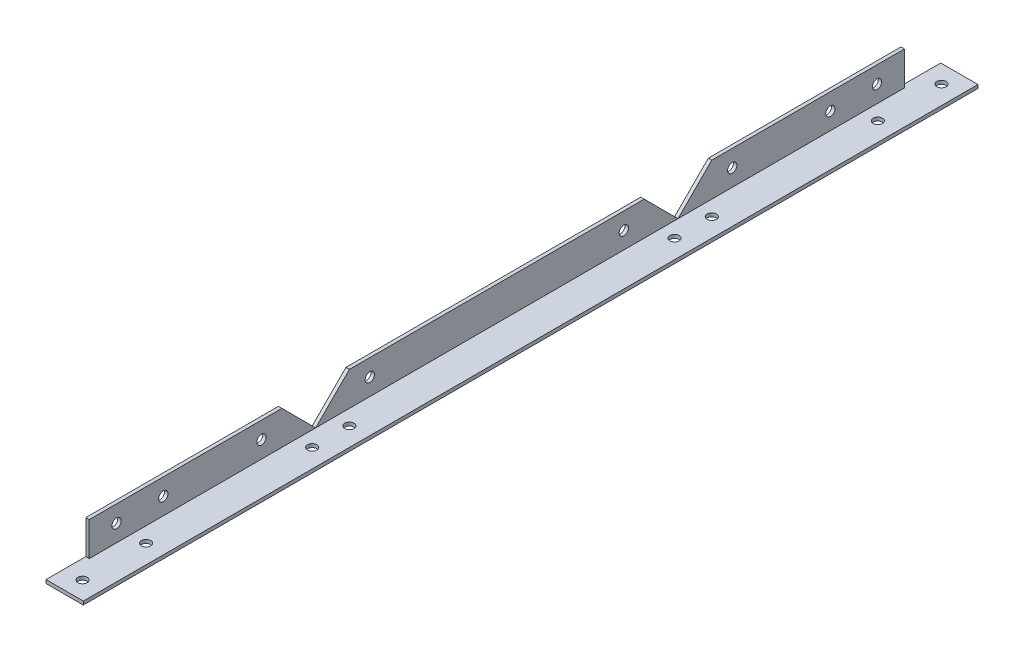
ISO-10303-21;
HEADER;
FILE_DESCRIPTION(('STEP AP214'),'2;1');
FILE_NAME('part.step','',(''),(''),'','','');
FILE_SCHEMA(('AUTOMOTIVE_DESIGN { 1 0 10303 214 1 1 1 1 }'));
ENDSEC;
DATA;
#1=APPLICATION_CONTEXT('core data for automotive mechanical design processes');
#2=APPLICATION_PROTOCOL_DEFINITION('international standard','automotive_design',2000,#1);
#3=PRODUCT_CONTEXT('',#1,'mechanical');
#4=PRODUCT('Part','Part','',(#3));
#5=PRODUCT_RELATED_PRODUCT_CATEGORY('part','',(#4));
#6=PRODUCT_DEFINITION_FORMATION('','',#4);
#7=PRODUCT_DEFINITION_CONTEXT('part definition',#1,'design');
#8=PRODUCT_DEFINITION('design','',#6,#7);
#9=PRODUCT_DEFINITION_SHAPE('','',#8);
#10=(LENGTH_UNIT() NAMED_UNIT(*) SI_UNIT(.MILLI.,.METRE.));
#11=(NAMED_UNIT(*) PLANE_ANGLE_UNIT() SI_UNIT($,.RADIAN.));
#12=(NAMED_UNIT(*) SI_UNIT($,.STERADIAN.) SOLID_ANGLE_UNIT());
#13=UNCERTAINTY_MEASURE_WITH_UNIT(LENGTH_MEASURE(1.E-05),#10,'distance_accuracy_value','');
#14=(GEOMETRIC_REPRESENTATION_CONTEXT(3) GLOBAL_UNCERTAINTY_ASSIGNED_CONTEXT((#13)) GLOBAL_UNIT_ASSIGNED_CONTEXT((#10,
#11,#12)) REPRESENTATION_CONTEXT('',''));
#15=CARTESIAN_POINT('',(0.,0.,0.));
#16=DIRECTION('',(0.,0.,1.));
#17=DIRECTION('',(1.,0.,0.));
#18=AXIS2_PLACEMENT_3D('',#15,#16,#17);
#19=CARTESIAN_POINT('',(0.,1.2490009027033E-13,208.28));
#20=DIRECTION('',(-1.,0.,0.));
#21=DIRECTION('',(0.,-1.,0.));
#22=AXIS2_PLACEMENT_3D('',#19,#20,#21);
#23=PLANE('',#22);
#24=CARTESIAN_POINT('',(0.,8.63599999999988,-194.31));
#25=DIRECTION('',(-1.,0.,0.));
#26=DIRECTION('',(0.,1.,0.));
#27=AXIS2_PLACEMENT_3D('',#24,#25,#26);
#28=CIRCLE('',#27,2.38125000000001);
#29=CARTESIAN_POINT('',(0.,11.0172499999999,-194.31));
#30=VERTEX_POINT('',#29);
#31=EDGE_CURVE('E164',#30,#30,#28,.T.);
#32=ORIENTED_EDGE('',*,*,#31,.T.);
#33=EDGE_LOOP('',(#32));
#34=FACE_BOUND('',#33,.T.);
#35=CARTESIAN_POINT('',(0.,8.63599999999988,-170.434));
#36=DIRECTION('',(-1.,0.,0.));
#37=DIRECTION('',(0.,1.,0.));
#38=AXIS2_PLACEMENT_3D('',#35,#36,#37);
#39=CIRCLE('',#38,2.38125000000001);
#40=CARTESIAN_POINT('',(0.,11.0172499999999,-170.434));
#41=VERTEX_POINT('',#40);
#42=EDGE_CURVE('E172',#41,#41,#39,.T.);
#43=ORIENTED_EDGE('',*,*,#42,.T.);
#44=EDGE_LOOP('',(#43));
#45=FACE_BOUND('',#44,.T.);
#46=CARTESIAN_POINT('',(0.,8.63599999999992,-120.269));
#47=DIRECTION('',(-1.,0.,0.));
#48=DIRECTION('',(0.,1.,0.));
#49=AXIS2_PLACEMENT_3D('',#46,#47,#48);
#50=CIRCLE('',#49,2.38125000000001);
#51=CARTESIAN_POINT('',(0.,11.0172499999999,-120.269));
#52=VERTEX_POINT('',#51);
#53=EDGE_CURVE('E178',#52,#52,#50,.T.);
#54=ORIENTED_EDGE('',*,*,#53,.T.);
#55=EDGE_LOOP('',(#54));
#56=FACE_BOUND('',#55,.T.);
#57=DIRECTION('',(0.,-0.707106781186543,0.707106781186551));
#58=VECTOR('',#57,1.);
#59=CARTESIAN_POINT('',(0.,0.,-92.583));
#60=LINE('',#59,#58);
#61=CARTESIAN_POINT('',(0.,17.2719999999999,-109.855));
#62=VERTEX_POINT('',#61);
#63=CARTESIAN_POINT('',(0.,0.,-92.583));
#64=VERTEX_POINT('',#63);
#65=EDGE_CURVE('E194',#62,#64,#60,.T.);
#66=ORIENTED_EDGE('',*,*,#65,.T.);
#67=DIRECTION('',(0.,0.,-1.));
#68=VECTOR('',#67,1.);
#69=CARTESIAN_POINT('',(0.,1.2490009027033E-13,208.28));
#70=LINE('',#69,#68);
#71=CARTESIAN_POINT('',(0.,-1.2490009027033E-13,-208.28));
#72=VERTEX_POINT('',#71);
#73=EDGE_CURVE('E310',#64,#72,#70,.T.);
#74=ORIENTED_EDGE('',*,*,#73,.T.);
#75=DIRECTION('',(0.,1.,0.));
#76=VECTOR('',#75,1.);
#77=CARTESIAN_POINT('',(0.,-1.2490009027033E-13,-208.28));
#78=LINE('',#77,#76);
#79=CARTESIAN_POINT('',(0.,17.2719999999999,-208.28));
#80=VERTEX_POINT('',#79);
#81=EDGE_CURVE('E208',#72,#80,#78,.T.);
#82=ORIENTED_EDGE('',*,*,#81,.T.);
#83=DIRECTION('',(0.,0.,-1.));
#84=VECTOR('',#83,1.);
#85=CARTESIAN_POINT('',(0.,17.2720000000001,208.28));
#86=LINE('',#85,#84);
#87=EDGE_CURVE('E306',#62,#80,#86,.T.);
#88=ORIENTED_EDGE('',*,*,#87,.F.);
#89=EDGE_LOOP('',(#66,#74,#82,#88));
#90=FACE_BOUND('',#89,.T.);
#91=ADVANCED_FACE('F35',(#34,#45,#56,#90),#23,.F.);
#92=CARTESIAN_POINT('',(0.,8.63599999999996,-64.8969999999998));
#93=DIRECTION('',(-1.,0.,0.));
#94=DIRECTION('',(0.,1.,0.));
#95=AXIS2_PLACEMENT_3D('',#92,#93,#94);
#96=CIRCLE('',#95,2.38125000000001);
#97=CARTESIAN_POINT('',(0.,11.01725,-64.8969999999998));
#98=VERTEX_POINT('',#97);
#99=EDGE_CURVE('E144',#98,#98,#96,.T.);
#100=ORIENTED_EDGE('',*,*,#99,.T.);
#101=EDGE_LOOP('',(#100));
#102=FACE_BOUND('',#101,.T.);
#103=CARTESIAN_POINT('',(0.,8.63600000000005,64.8969999999998));
#104=DIRECTION('',(1.,0.,0.));
#105=DIRECTION('',(0.,1.,0.));
#106=AXIS2_PLACEMENT_3D('',#103,#104,#105);
#107=CIRCLE('',#106,2.38125000000001);
#108=CARTESIAN_POINT('',(0.,11.0172500000001,64.8969999999998));
#109=VERTEX_POINT('',#108);
#110=EDGE_CURVE('E251',#109,#109,#107,.T.);
#111=ORIENTED_EDGE('',*,*,#110,.F.);
#112=EDGE_LOOP('',(#111));
#113=FACE_BOUND('',#112,.T.);
#114=DIRECTION('',(0.,0.707106781186544,0.707106781186551));
#115=VECTOR('',#114,1.);
#116=CARTESIAN_POINT('',(0.,17.272,-75.3109999999998));
#117=LINE('',#116,#115);
#118=CARTESIAN_POINT('',(0.,17.272,-75.3109999999998));
#119=VERTEX_POINT('',#118);
#120=EDGE_CURVE('E171',#64,#119,#117,.T.);
#121=ORIENTED_EDGE('',*,*,#120,.T.);
#122=CARTESIAN_POINT('',(0.,17.2720000000001,75.3109999999998));
#123=VERTEX_POINT('',#122);
#124=EDGE_CURVE('E311',#123,#119,#86,.T.);
#125=ORIENTED_EDGE('',*,*,#124,.F.);
#126=DIRECTION('',(0.,0.707106781186544,-0.707106781186551));
#127=VECTOR('',#126,1.);
#128=CARTESIAN_POINT('',(0.,17.2720000000001,75.3109999999998));
#129=LINE('',#128,#127);
#130=CARTESIAN_POINT('',(0.,0.,92.583));
#131=VERTEX_POINT('',#130);
#132=EDGE_CURVE('E259',#131,#123,#129,.T.);
#133=ORIENTED_EDGE('',*,*,#132,.F.);
#134=EDGE_CURVE('E317',#131,#64,#70,.T.);
#135=ORIENTED_EDGE('',*,*,#134,.T.);
#136=EDGE_LOOP('',(#121,#125,#133,#135));
#137=FACE_BOUND('',#136,.T.);
#138=ADVANCED_FACE('F335',(#102,#113,#137),#23,.F.);
#139=CARTESIAN_POINT('',(0.,17.2720000000001,208.28));
#140=DIRECTION('',(0.,-1.,0.));
#141=DIRECTION('',(0.,0.,-1.));
#142=AXIS2_PLACEMENT_3D('',#139,#140,#141);
#143=PLANE('',#142);
#144=DIRECTION('',(1.,0.,0.));
#145=VECTOR('',#144,1.);
#146=CARTESIAN_POINT('',(-40.3993661073767,17.2719999999999,-109.855));
#147=LINE('',#146,#145);
#148=CARTESIAN_POINT('',(-1.778,17.2719999999999,-109.855));
#149=VERTEX_POINT('',#148);
#150=EDGE_CURVE('E199',#149,#62,#147,.T.);
#151=ORIENTED_EDGE('',*,*,#150,.T.);
#152=ORIENTED_EDGE('',*,*,#87,.T.);
#153=DIRECTION('',(-1.,0.,0.));
#154=VECTOR('',#153,1.);
#155=CARTESIAN_POINT('',(0.,17.2719999999999,-208.28));
#156=LINE('',#155,#154);
#157=CARTESIAN_POINT('',(-1.778,17.2719999999999,-208.28));
#158=VERTEX_POINT('',#157);
#159=EDGE_CURVE('E205',#80,#158,#156,.T.);
#160=ORIENTED_EDGE('',*,*,#159,.T.);
#161=DIRECTION('',(0.,0.,-1.));
#162=VECTOR('',#161,1.);
#163=CARTESIAN_POINT('',(-1.77800000000004,17.2720000000001,208.28));
#164=LINE('',#163,#162);
#165=EDGE_CURVE('E303',#149,#158,#164,.T.);
#166=ORIENTED_EDGE('',*,*,#165,.F.);
#167=EDGE_LOOP('',(#151,#152,#160,#166));
#168=FACE_BOUND('',#167,.T.);
#169=ADVANCED_FACE('F322',(#168),#143,.F.);
#170=DIRECTION('',(1.,0.,0.));
#171=VECTOR('',#170,1.);
#172=CARTESIAN_POINT('',(-40.3993661073767,17.272,-75.3109999999998));
#173=LINE('',#172,#171);
#174=CARTESIAN_POINT('',(-1.778,17.272,-75.3109999999998));
#175=VERTEX_POINT('',#174);
#176=EDGE_CURVE('E197',#175,#119,#173,.T.);
#177=ORIENTED_EDGE('',*,*,#176,.F.);
#178=CARTESIAN_POINT('',(-1.778,17.2720000000001,75.3109999999998));
#179=VERTEX_POINT('',#178);
#180=EDGE_CURVE('E307',#179,#175,#164,.T.);
#181=ORIENTED_EDGE('',*,*,#180,.F.);
#182=DIRECTION('',(1.,0.,0.));
#183=VECTOR('',#182,1.);
#184=CARTESIAN_POINT('',(-40.3993661073767,17.2720000000001,75.3109999999998));
#185=LINE('',#184,#183);
#186=EDGE_CURVE('E287',#179,#123,#185,.T.);
#187=ORIENTED_EDGE('',*,*,#186,.T.);
#188=ORIENTED_EDGE('',*,*,#124,.T.);
#189=EDGE_LOOP('',(#177,#181,#187,#188));
#190=FACE_BOUND('',#189,.T.);
#191=ADVANCED_FACE('F364',(#190),#143,.F.);
#192=CARTESIAN_POINT('',(-1.77800000000004,17.2720000000001,208.28));
#193=DIRECTION('',(1.,0.,0.));
#194=DIRECTION('',(0.,1.,0.));
#195=AXIS2_PLACEMENT_3D('',#192,#193,#194);
#196=PLANE('',#195);
#197=CARTESIAN_POINT('',(-1.778,8.63599999999988,-194.31));
#198=DIRECTION('',(1.,0.,0.));
#199=DIRECTION('',(0.,1.,0.));
#200=AXIS2_PLACEMENT_3D('',#197,#198,#199);
#201=CIRCLE('',#200,2.38125000000001);
#202=CARTESIAN_POINT('',(-1.778,11.0172499999999,-194.31));
#203=VERTEX_POINT('',#202);
#204=EDGE_CURVE('E167',#203,#203,#201,.T.);
#205=ORIENTED_EDGE('',*,*,#204,.T.);
#206=EDGE_LOOP('',(#205));
#207=FACE_BOUND('',#206,.T.);
#208=CARTESIAN_POINT('',(-1.778,8.63599999999988,-170.434));
#209=DIRECTION('',(1.,0.,0.));
#210=DIRECTION('',(0.,1.,0.));
#211=AXIS2_PLACEMENT_3D('',#208,#209,#210);
#212=CIRCLE('',#211,2.38125000000001);
#213=CARTESIAN_POINT('',(-1.778,11.0172499999999,-170.434));
#214=VERTEX_POINT('',#213);
#215=EDGE_CURVE('E168',#214,#214,#212,.T.);
#216=ORIENTED_EDGE('',*,*,#215,.T.);
#217=EDGE_LOOP('',(#216));
#218=FACE_BOUND('',#217,.T.);
#219=CARTESIAN_POINT('',(-1.778,8.63599999999992,-120.269));
#220=DIRECTION('',(1.,0.,0.));
#221=DIRECTION('',(0.,1.,0.));
#222=AXIS2_PLACEMENT_3D('',#219,#220,#221);
#223=CIRCLE('',#222,2.38125000000001);
#224=CARTESIAN_POINT('',(-1.778,11.0172499999999,-120.269));
#225=VERTEX_POINT('',#224);
#226=EDGE_CURVE('E175',#225,#225,#223,.T.);
#227=ORIENTED_EDGE('',*,*,#226,.T.);
#228=EDGE_LOOP('',(#227));
#229=FACE_BOUND('',#228,.T.);
#230=CARTESIAN_POINT('',(-1.778,8.63599999999996,-64.8969999999998));
#231=DIRECTION('',(1.,0.,0.));
#232=DIRECTION('',(0.,1.,0.));
#233=AXIS2_PLACEMENT_3D('',#230,#231,#232);
#234=CIRCLE('',#233,2.38125000000001);
#235=CARTESIAN_POINT('',(-1.778,11.01725,-64.8969999999998));
#236=VERTEX_POINT('',#235);
#237=EDGE_CURVE('E181',#236,#236,#234,.T.);
#238=ORIENTED_EDGE('',*,*,#237,.T.);
#239=EDGE_LOOP('',(#238));
#240=FACE_BOUND('',#239,.T.);
#241=CARTESIAN_POINT('',(-1.778,8.63600000000005,64.8969999999998));
#242=DIRECTION('',(1.,0.,0.));
#243=DIRECTION('',(0.,1.,0.));
#244=AXIS2_PLACEMENT_3D('',#241,#242,#243);
#245=CIRCLE('',#244,2.38125000000001);
#246=CARTESIAN_POINT('',(-1.778,11.0172500000001,64.8969999999998));
#247=VERTEX_POINT('',#246);
#248=EDGE_CURVE('E269',#247,#247,#245,.F.);
#249=ORIENTED_EDGE('',*,*,#248,.F.);
#250=EDGE_LOOP('',(#249));
#251=FACE_BOUND('',#250,.T.);
#252=CARTESIAN_POINT('',(-1.77800000000004,8.63600000000009,120.269));
#253=DIRECTION('',(1.,0.,0.));
#254=DIRECTION('',(0.,1.,0.));
#255=AXIS2_PLACEMENT_3D('',#252,#253,#254);
#256=CIRCLE('',#255,2.38125000000001);
#257=CARTESIAN_POINT('',(-1.77800000000004,11.0172500000001,120.269));
#258=VERTEX_POINT('',#257);
#259=EDGE_CURVE('E263',#258,#258,#256,.F.);
#260=ORIENTED_EDGE('',*,*,#259,.F.);
#261=EDGE_LOOP('',(#260));
#262=FACE_BOUND('',#261,.T.);
#263=CARTESIAN_POINT('',(-1.77800000000004,8.63600000000013,170.434));
#264=DIRECTION('',(1.,0.,0.));
#265=DIRECTION('',(0.,1.,0.));
#266=AXIS2_PLACEMENT_3D('',#263,#264,#265);
#267=CIRCLE('',#266,2.38125000000001);
#268=CARTESIAN_POINT('',(-1.77800000000004,11.0172500000001,170.434));
#269=VERTEX_POINT('',#268);
#270=EDGE_CURVE('E256',#269,#269,#267,.F.);
#271=ORIENTED_EDGE('',*,*,#270,.F.);
#272=EDGE_LOOP('',(#271));
#273=FACE_BOUND('',#272,.T.);
#274=CARTESIAN_POINT('',(-1.77800000000004,8.63600000000013,194.31));
#275=DIRECTION('',(1.,0.,0.));
#276=DIRECTION('',(0.,1.,0.));
#277=AXIS2_PLACEMENT_3D('',#274,#275,#276);
#278=CIRCLE('',#277,2.38125000000001);
#279=CARTESIAN_POINT('',(-1.77800000000004,11.0172500000001,194.31));
#280=VERTEX_POINT('',#279);
#281=EDGE_CURVE('E255',#280,#280,#278,.F.);
#282=ORIENTED_EDGE('',*,*,#281,.F.);
#283=EDGE_LOOP('',(#282));
#284=FACE_BOUND('',#283,.T.);
#285=DIRECTION('',(0.,0.707106781186543,-0.707106781186551));
#286=VECTOR('',#285,1.);
#287=CARTESIAN_POINT('',(-1.778,0.,-92.583));
#288=LINE('',#287,#286);
#289=CARTESIAN_POINT('',(-1.778,0.,-92.583));
#290=VERTEX_POINT('',#289);
#291=EDGE_CURVE('E191',#290,#149,#288,.T.);
#292=ORIENTED_EDGE('',*,*,#291,.T.);
#293=ORIENTED_EDGE('',*,*,#165,.T.);
#294=DIRECTION('',(0.,-1.,0.));
#295=VECTOR('',#294,1.);
#296=CARTESIAN_POINT('',(-1.778,17.2719999999999,-208.28));
#297=LINE('',#296,#295);
#298=CARTESIAN_POINT('',(-1.778,-1.2490009027033E-13,-208.28));
#299=VERTEX_POINT('',#298);
#300=EDGE_CURVE('E143',#158,#299,#297,.T.);
#301=ORIENTED_EDGE('',*,*,#300,.T.);
#302=DIRECTION('',(0.,0.,1.));
#303=VECTOR('',#302,1.);
#304=CARTESIAN_POINT('',(-1.778,-1.66533453693773E-13,-228.6));
#305=LINE('',#304,#303);
#306=CARTESIAN_POINT('',(-1.778,-1.66533453693773E-13,-228.6));
#307=VERTEX_POINT('',#306);
#308=EDGE_CURVE('E52',#307,#299,#305,.T.);
#309=ORIENTED_EDGE('',*,*,#308,.F.);
#310=DIRECTION('',(0.,-1.,0.));
#311=VECTOR('',#310,1.);
#312=CARTESIAN_POINT('',(-1.778,-1.77800000000017,-228.6));
#313=LINE('',#312,#311);
#314=CARTESIAN_POINT('',(-1.778,-1.77800000000017,-228.6));
#315=VERTEX_POINT('',#314);
#316=EDGE_CURVE('E140',#307,#315,#313,.T.);
#317=ORIENTED_EDGE('',*,*,#316,.T.);
#318=DIRECTION('',(0.,0.,-1.));
#319=VECTOR('',#318,1.);
#320=CARTESIAN_POINT('',(-1.77800000000004,-1.77799999999988,208.28));
#321=LINE('',#320,#319);
#322=CARTESIAN_POINT('',(-1.77800000000003,-1.77799999999984,228.6));
#323=VERTEX_POINT('',#322);
#324=EDGE_CURVE('E301',#323,#315,#321,.T.);
#325=ORIENTED_EDGE('',*,*,#324,.F.);
#326=DIRECTION('',(0.,-1.,0.));
#327=VECTOR('',#326,1.);
#328=CARTESIAN_POINT('',(-1.77800000000003,-1.77799999999984,228.6));
#329=LINE('',#328,#327);
#330=CARTESIAN_POINT('',(-1.77800000000003,1.66533453693773E-13,228.6));
#331=VERTEX_POINT('',#330);
#332=EDGE_CURVE('E235',#331,#323,#329,.T.);
#333=ORIENTED_EDGE('',*,*,#332,.F.);
#334=DIRECTION('',(0.,0.,-1.));
#335=VECTOR('',#334,1.);
#336=CARTESIAN_POINT('',(-1.77800000000003,1.66533453693773E-13,228.6));
#337=LINE('',#336,#335);
#338=CARTESIAN_POINT('',(-1.77800000000004,1.2490009027033E-13,208.28));
#339=VERTEX_POINT('',#338);
#340=EDGE_CURVE('E246',#331,#339,#337,.T.);
#341=ORIENTED_EDGE('',*,*,#340,.T.);
#342=DIRECTION('',(0.,-1.,0.));
#343=VECTOR('',#342,1.);
#344=CARTESIAN_POINT('',(-1.77800000000004,17.2720000000001,208.28));
#345=LINE('',#344,#343);
#346=CARTESIAN_POINT('',(-1.77800000000004,17.2720000000001,208.28));
#347=VERTEX_POINT('',#346);
#348=EDGE_CURVE('E296',#347,#339,#345,.T.);
#349=ORIENTED_EDGE('',*,*,#348,.F.);
#350=CARTESIAN_POINT('',(-1.778,17.2720000000001,109.855));
#351=VERTEX_POINT('',#350);
#352=EDGE_CURVE('E304',#347,#351,#164,.T.);
#353=ORIENTED_EDGE('',*,*,#352,.T.);
#354=DIRECTION('',(0.,0.707106781186544,0.707106781186552));
#355=VECTOR('',#354,1.);
#356=CARTESIAN_POINT('',(-1.778,0.,92.583));
#357=LINE('',#356,#355);
#358=CARTESIAN_POINT('',(-1.778,0.,92.583));
#359=VERTEX_POINT('',#358);
#360=EDGE_CURVE('E276',#359,#351,#357,.T.);
#361=ORIENTED_EDGE('',*,*,#360,.F.);
#362=DIRECTION('',(0.,-0.707106781186544,0.707106781186551));
#363=VECTOR('',#362,1.);
#364=CARTESIAN_POINT('',(-1.778,17.2720000000001,75.3109999999998));
#365=LINE('',#364,#363);
#366=EDGE_CURVE('E278',#179,#359,#365,.T.);
#367=ORIENTED_EDGE('',*,*,#366,.F.);
#368=ORIENTED_EDGE('',*,*,#180,.T.);
#369=DIRECTION('',(0.,-0.707106781186544,-0.707106781186551));
#370=VECTOR('',#369,1.);
#371=CARTESIAN_POINT('',(-1.778,17.272,-75.3109999999998));
#372=LINE('',#371,#370);
#373=EDGE_CURVE('E188',#175,#290,#372,.T.);
#374=ORIENTED_EDGE('',*,*,#373,.T.);
#375=EDGE_LOOP('',(#292,#293,#301,#309,#317,#325,#333,#341,#349,#353,#361,#367,#368,#374));
#376=FACE_BOUND('',#375,.T.);
#377=ADVANCED_FACE('F139',(#207,#218,#229,#240,#251,#262,#273,#284,#376),#196,.F.);
#378=CARTESIAN_POINT('',(0.,1.2490009027033E-13,208.28));
#379=DIRECTION('',(0.,0.,-1.));
#380=DIRECTION('',(-1.,0.,0.));
#381=AXIS2_PLACEMENT_3D('',#378,#379,#380);
#382=PLANE('',#381);
#383=DIRECTION('',(-1.,0.,0.));
#384=VECTOR('',#383,1.);
#385=CARTESIAN_POINT('',(-1.77800000000004,1.2490009027033E-13,208.28));
#386=LINE('',#385,#384);
#387=CARTESIAN_POINT('',(0.,1.2490009027033E-13,208.28));
#388=VERTEX_POINT('',#387);
#389=EDGE_CURVE('E44',#388,#339,#386,.T.);
#390=ORIENTED_EDGE('',*,*,#389,.F.);
#391=DIRECTION('',(0.,1.,0.));
#392=VECTOR('',#391,1.);
#393=CARTESIAN_POINT('',(0.,1.2490009027033E-13,208.28));
#394=LINE('',#393,#392);
#395=CARTESIAN_POINT('',(0.,17.2720000000001,208.28));
#396=VERTEX_POINT('',#395);
#397=EDGE_CURVE('E282',#388,#396,#394,.T.);
#398=ORIENTED_EDGE('',*,*,#397,.T.);
#399=DIRECTION('',(-1.,0.,0.));
#400=VECTOR('',#399,1.);
#401=CARTESIAN_POINT('',(0.,17.2720000000001,208.28));
#402=LINE('',#401,#400);
#403=EDGE_CURVE('E294',#396,#347,#402,.T.);
#404=ORIENTED_EDGE('',*,*,#403,.T.);
#405=ORIENTED_EDGE('',*,*,#348,.T.);
#406=EDGE_LOOP('',(#390,#398,#404,#405));
#407=FACE_BOUND('',#406,.T.);
#408=ADVANCED_FACE('F380',(#407),#382,.F.);
#409=CARTESIAN_POINT('',(17.272,1.2490009027033E-13,208.28));
#410=DIRECTION('',(0.,-1.,0.));
#411=DIRECTION('',(1.,0.,0.));
#412=AXIS2_PLACEMENT_3D('',#409,#410,#411);
#413=PLANE('',#412);
#414=CARTESIAN_POINT('',(7.747,0.,-83.058));
#415=DIRECTION('',(0.,-1.,0.));
#416=DIRECTION('',(-1.,0.,0.));
#417=AXIS2_PLACEMENT_3D('',#414,#415,#416);
#418=CIRCLE('',#417,2.38125);
#419=CARTESIAN_POINT('',(5.36575,0.,-83.058));
#420=VERTEX_POINT('',#419);
#421=EDGE_CURVE('E509',#420,#420,#418,.T.);
#422=ORIENTED_EDGE('',*,*,#421,.T.);
#423=EDGE_LOOP('',(#422));
#424=FACE_BOUND('',#423,.T.);
#425=CARTESIAN_POINT('',(7.747,0.,-102.108));
#426=DIRECTION('',(0.,-1.,0.));
#427=DIRECTION('',(-1.,0.,0.));
#428=AXIS2_PLACEMENT_3D('',#425,#426,#427);
#429=CIRCLE('',#428,2.38125);
#430=CARTESIAN_POINT('',(5.36575,0.,-102.108));
#431=VERTEX_POINT('',#430);
#432=EDGE_CURVE('E515',#431,#431,#429,.T.);
#433=ORIENTED_EDGE('',*,*,#432,.T.);
#434=EDGE_LOOP('',(#433));
#435=FACE_BOUND('',#434,.T.);
#436=CARTESIAN_POINT('',(7.74699999999999,-1.2490009027033E-13,-186.944));
#437=DIRECTION('',(0.,-1.,0.));
#438=DIRECTION('',(-1.,0.,0.));
#439=AXIS2_PLACEMENT_3D('',#436,#437,#438);
#440=CIRCLE('',#439,2.38125);
#441=CARTESIAN_POINT('',(5.36574999999999,-1.2496453235552E-13,-186.944));
#442=VERTEX_POINT('',#441);
#443=EDGE_CURVE('E521',#442,#442,#440,.T.);
#444=ORIENTED_EDGE('',*,*,#443,.T.);
#445=EDGE_LOOP('',(#444));
#446=FACE_BOUND('',#445,.T.);
#447=CARTESIAN_POINT('',(7.74699999999999,-1.66533453693773E-13,-219.456));
#448=DIRECTION('',(0.,-1.,0.));
#449=DIRECTION('',(-1.,0.,0.));
#450=AXIS2_PLACEMENT_3D('',#447,#448,#449);
#451=CIRCLE('',#450,2.38125);
#452=CARTESIAN_POINT('',(5.36574999999999,-1.66597895778963E-13,-219.456));
#453=VERTEX_POINT('',#452);
#454=EDGE_CURVE('E512',#453,#453,#451,.T.);
#455=ORIENTED_EDGE('',*,*,#454,.T.);
#456=EDGE_LOOP('',(#455));
#457=FACE_BOUND('',#456,.T.);
#458=CARTESIAN_POINT('',(7.747,0.,83.058));
#459=DIRECTION('',(0.,1.,0.));
#460=DIRECTION('',(-1.,0.,0.));
#461=AXIS2_PLACEMENT_3D('',#458,#459,#460);
#462=CIRCLE('',#461,2.38125);
#463=CARTESIAN_POINT('',(5.36575,0.,83.058));
#464=VERTEX_POINT('',#463);
#465=EDGE_CURVE('E212',#464,#464,#462,.T.);
#466=ORIENTED_EDGE('',*,*,#465,.F.);
#467=EDGE_LOOP('',(#466));
#468=FACE_BOUND('',#467,.T.);
#469=CARTESIAN_POINT('',(7.747,0.,102.108));
#470=DIRECTION('',(0.,1.,0.));
#471=DIRECTION('',(-1.,0.,0.));
#472=AXIS2_PLACEMENT_3D('',#469,#470,#471);
#473=CIRCLE('',#472,2.38125);
#474=CARTESIAN_POINT('',(5.36575,0.,102.108));
#475=VERTEX_POINT('',#474);
#476=EDGE_CURVE('E220',#475,#475,#473,.T.);
#477=ORIENTED_EDGE('',*,*,#476,.F.);
#478=EDGE_LOOP('',(#477));
#479=FACE_BOUND('',#478,.T.);
#480=CARTESIAN_POINT('',(7.74699999999996,1.2490009027033E-13,186.944));
#481=DIRECTION('',(0.,1.,0.));
#482=DIRECTION('',(-1.,0.,0.));
#483=AXIS2_PLACEMENT_3D('',#480,#481,#482);
#484=CIRCLE('',#483,2.38125);
#485=CARTESIAN_POINT('',(5.36574999999996,1.24835648185141E-13,186.944));
#486=VERTEX_POINT('',#485);
#487=EDGE_CURVE('E211',#486,#486,#484,.T.);
#488=ORIENTED_EDGE('',*,*,#487,.F.);
#489=EDGE_LOOP('',(#488));
#490=FACE_BOUND('',#489,.T.);
#491=CARTESIAN_POINT('',(7.74699999999996,1.2490009027033E-13,219.456));
#492=DIRECTION('',(0.,1.,0.));
#493=DIRECTION('',(-1.,0.,0.));
#494=AXIS2_PLACEMENT_3D('',#491,#492,#493);
#495=CIRCLE('',#494,2.38125);
#496=CARTESIAN_POINT('',(5.36574999999996,1.24835648185141E-13,219.456));
#497=VERTEX_POINT('',#496);
#498=EDGE_CURVE('E219',#497,#497,#495,.T.);
#499=ORIENTED_EDGE('',*,*,#498,.F.);
#500=EDGE_LOOP('',(#499));
#501=FACE_BOUND('',#500,.T.);
#502=DIRECTION('',(0.,0.,-1.));
#503=VECTOR('',#502,1.);
#504=CARTESIAN_POINT('',(17.272,1.2490009027033E-13,208.28));
#505=LINE('',#504,#503);
#506=CARTESIAN_POINT('',(17.272,1.66533453693773E-13,228.6));
#507=VERTEX_POINT('',#506);
#508=CARTESIAN_POINT('',(17.272,-1.66533453693773E-13,-228.6));
#509=VERTEX_POINT('',#508);
#510=EDGE_CURVE('E157',#507,#509,#505,.T.);
#511=ORIENTED_EDGE('',*,*,#510,.T.);
#512=DIRECTION('',(-1.,0.,0.));
#513=VECTOR('',#512,1.);
#514=CARTESIAN_POINT('',(-1.778,-1.66533453693773E-13,-228.6));
#515=LINE('',#514,#513);
#516=EDGE_CURVE('E151',#509,#307,#515,.T.);
#517=ORIENTED_EDGE('',*,*,#516,.T.);
#518=ORIENTED_EDGE('',*,*,#308,.T.);
#519=DIRECTION('',(-1.,0.,0.));
#520=VECTOR('',#519,1.);
#521=CARTESIAN_POINT('',(-1.778,-1.2490009027033E-13,-208.28));
#522=LINE('',#521,#520);
#523=EDGE_CURVE('E11',#72,#299,#522,.T.);
#524=ORIENTED_EDGE('',*,*,#523,.F.);
#525=ORIENTED_EDGE('',*,*,#73,.F.);
#526=ORIENTED_EDGE('',*,*,#134,.F.);
#527=EDGE_CURVE('E39',#388,#131,#70,.T.);
#528=ORIENTED_EDGE('',*,*,#527,.F.);
#529=ORIENTED_EDGE('',*,*,#389,.T.);
#530=ORIENTED_EDGE('',*,*,#340,.F.);
#531=DIRECTION('',(-1.,0.,0.));
#532=VECTOR('',#531,1.);
#533=CARTESIAN_POINT('',(-1.77800000000003,1.66533453693773E-13,228.6));
#534=LINE('',#533,#532);
#535=EDGE_CURVE('E244',#507,#331,#534,.T.);
#536=ORIENTED_EDGE('',*,*,#535,.F.);
#537=EDGE_LOOP('',(#511,#517,#518,#524,#525,#526,#528,#529,#530,#536));
#538=FACE_BOUND('',#537,.T.);
#539=ADVANCED_FACE('F37',(#424,#435,#446,#457,#468,#479,#490,#501,#538),#413,.F.);
#540=CARTESIAN_POINT('',(0.,8.63600000000013,194.31));
#541=DIRECTION('',(1.,0.,0.));
#542=DIRECTION('',(0.,1.,0.));
#543=AXIS2_PLACEMENT_3D('',#540,#541,#542);
#544=CIRCLE('',#543,2.38125000000001);
#545=CARTESIAN_POINT('',(0.,11.0172500000001,194.31));
#546=VERTEX_POINT('',#545);
#547=EDGE_CURVE('E252',#546,#546,#544,.T.);
#548=ORIENTED_EDGE('',*,*,#547,.F.);
#549=EDGE_LOOP('',(#548));
#550=FACE_BOUND('',#549,.T.);
#551=CARTESIAN_POINT('',(0.,8.63600000000013,170.434));
#552=DIRECTION('',(1.,0.,0.));
#553=DIRECTION('',(0.,1.,0.));
#554=AXIS2_PLACEMENT_3D('',#551,#552,#553);
#555=CIRCLE('',#554,2.38125000000001);
#556=CARTESIAN_POINT('',(0.,11.0172500000001,170.434));
#557=VERTEX_POINT('',#556);
#558=EDGE_CURVE('E260',#557,#557,#555,.T.);
#559=ORIENTED_EDGE('',*,*,#558,.F.);
#560=EDGE_LOOP('',(#559));
#561=FACE_BOUND('',#560,.T.);
#562=CARTESIAN_POINT('',(0.,8.63600000000009,120.269));
#563=DIRECTION('',(1.,0.,0.));
#564=DIRECTION('',(0.,1.,0.));
#565=AXIS2_PLACEMENT_3D('',#562,#563,#564);
#566=CIRCLE('',#565,2.38125000000001);
#567=CARTESIAN_POINT('',(0.,11.0172500000001,120.269));
#568=VERTEX_POINT('',#567);
#569=EDGE_CURVE('E266',#568,#568,#566,.T.);
#570=ORIENTED_EDGE('',*,*,#569,.F.);
#571=EDGE_LOOP('',(#570));
#572=FACE_BOUND('',#571,.T.);
#573=ORIENTED_EDGE('',*,*,#527,.T.);
#574=DIRECTION('',(0.,-0.707106781186544,-0.707106781186552));
#575=VECTOR('',#574,1.);
#576=CARTESIAN_POINT('',(0.,0.,92.583));
#577=LINE('',#576,#575);
#578=CARTESIAN_POINT('',(0.,17.2720000000001,109.855));
#579=VERTEX_POINT('',#578);
#580=EDGE_CURVE('E284',#579,#131,#577,.T.);
#581=ORIENTED_EDGE('',*,*,#580,.F.);
#582=EDGE_CURVE('E308',#396,#579,#86,.T.);
#583=ORIENTED_EDGE('',*,*,#582,.F.);
#584=ORIENTED_EDGE('',*,*,#397,.F.);
#585=EDGE_LOOP('',(#573,#581,#583,#584));
#586=FACE_BOUND('',#585,.T.);
#587=ADVANCED_FACE('F340',(#550,#561,#572,#586),#23,.F.);
#588=ORIENTED_EDGE('',*,*,#582,.T.);
#589=DIRECTION('',(1.,0.,0.));
#590=VECTOR('',#589,1.);
#591=CARTESIAN_POINT('',(-40.3993661073767,17.2720000000001,109.855));
#592=LINE('',#591,#590);
#593=EDGE_CURVE('E289',#351,#579,#592,.T.);
#594=ORIENTED_EDGE('',*,*,#593,.F.);
#595=ORIENTED_EDGE('',*,*,#352,.F.);
#596=ORIENTED_EDGE('',*,*,#403,.F.);
#597=EDGE_LOOP('',(#588,#594,#595,#596));
#598=FACE_BOUND('',#597,.T.);
#599=ADVANCED_FACE('F354',(#598),#143,.F.);
#600=CARTESIAN_POINT('',(-1.77800000000004,-1.77799999999988,208.28));
#601=DIRECTION('',(0.,1.,0.));
#602=DIRECTION('',(-1.,0.,0.));
#603=AXIS2_PLACEMENT_3D('',#600,#601,#602);
#604=PLANE('',#603);
#605=CARTESIAN_POINT('',(7.747,-1.77800000000004,-83.058));
#606=DIRECTION('',(0.,1.,0.));
#607=DIRECTION('',(-1.,0.,0.));
#608=AXIS2_PLACEMENT_3D('',#605,#606,#607);
#609=CIRCLE('',#608,2.38125);
#610=CARTESIAN_POINT('',(5.36575,-1.77800000000004,-83.058));
#611=VERTEX_POINT('',#610);
#612=EDGE_CURVE('E506',#611,#611,#609,.T.);
#613=ORIENTED_EDGE('',*,*,#612,.T.);
#614=EDGE_LOOP('',(#613));
#615=FACE_BOUND('',#614,.T.);
#616=CARTESIAN_POINT('',(7.747,-1.77800000000009,-102.108));
#617=DIRECTION('',(0.,1.,0.));
#618=DIRECTION('',(-1.,0.,0.));
#619=AXIS2_PLACEMENT_3D('',#616,#617,#618);
#620=CIRCLE('',#619,2.38125);
#621=CARTESIAN_POINT('',(5.36575,-1.77800000000009,-102.108));
#622=VERTEX_POINT('',#621);
#623=EDGE_CURVE('E510',#622,#622,#620,.T.);
#624=ORIENTED_EDGE('',*,*,#623,.T.);
#625=EDGE_LOOP('',(#624));
#626=FACE_BOUND('',#625,.T.);
#627=CARTESIAN_POINT('',(7.74699999999999,-1.77800000000013,-186.944));
#628=DIRECTION('',(0.,1.,0.));
#629=DIRECTION('',(-1.,0.,0.));
#630=AXIS2_PLACEMENT_3D('',#627,#628,#629);
#631=CIRCLE('',#630,2.38125);
#632=CARTESIAN_POINT('',(5.36574999999999,-1.77800000000013,-186.944));
#633=VERTEX_POINT('',#632);
#634=EDGE_CURVE('E519',#633,#633,#631,.T.);
#635=ORIENTED_EDGE('',*,*,#634,.T.);
#636=EDGE_LOOP('',(#635));
#637=FACE_BOUND('',#636,.T.);
#638=CARTESIAN_POINT('',(7.74699999999999,-1.77800000000017,-219.456));
#639=DIRECTION('',(0.,1.,0.));
#640=DIRECTION('',(-1.,0.,0.));
#641=AXIS2_PLACEMENT_3D('',#638,#639,#640);
#642=CIRCLE('',#641,2.38125);
#643=CARTESIAN_POINT('',(5.36574999999999,-1.77800000000017,-219.456));
#644=VERTEX_POINT('',#643);
#645=EDGE_CURVE('E154',#644,#644,#642,.T.);
#646=ORIENTED_EDGE('',*,*,#645,.T.);
#647=EDGE_LOOP('',(#646));
#648=FACE_BOUND('',#647,.T.);
#649=CARTESIAN_POINT('',(7.747,-1.77799999999996,83.058));
#650=DIRECTION('',(0.,1.,0.));
#651=DIRECTION('',(-1.,0.,0.));
#652=AXIS2_PLACEMENT_3D('',#649,#650,#651);
#653=CIRCLE('',#652,2.38125);
#654=CARTESIAN_POINT('',(5.36575,-1.77799999999996,83.058));
#655=VERTEX_POINT('',#654);
#656=EDGE_CURVE('E215',#655,#655,#653,.F.);
#657=ORIENTED_EDGE('',*,*,#656,.F.);
#658=EDGE_LOOP('',(#657));
#659=FACE_BOUND('',#658,.T.);
#660=CARTESIAN_POINT('',(7.747,-1.77799999999992,102.108));
#661=DIRECTION('',(0.,1.,0.));
#662=DIRECTION('',(-1.,0.,0.));
#663=AXIS2_PLACEMENT_3D('',#660,#661,#662);
#664=CIRCLE('',#663,2.38125);
#665=CARTESIAN_POINT('',(5.36575,-1.77799999999992,102.108));
#666=VERTEX_POINT('',#665);
#667=EDGE_CURVE('E216',#666,#666,#664,.F.);
#668=ORIENTED_EDGE('',*,*,#667,.F.);
#669=EDGE_LOOP('',(#668));
#670=FACE_BOUND('',#669,.T.);
#671=CARTESIAN_POINT('',(7.74699999999996,-1.77799999999988,186.944));
#672=DIRECTION('',(0.,1.,0.));
#673=DIRECTION('',(-1.,0.,0.));
#674=AXIS2_PLACEMENT_3D('',#671,#672,#673);
#675=CIRCLE('',#674,2.38125);
#676=CARTESIAN_POINT('',(5.36574999999996,-1.77799999999988,186.944));
#677=VERTEX_POINT('',#676);
#678=EDGE_CURVE('E223',#677,#677,#675,.F.);
#679=ORIENTED_EDGE('',*,*,#678,.F.);
#680=EDGE_LOOP('',(#679));
#681=FACE_BOUND('',#680,.T.);
#682=CARTESIAN_POINT('',(7.74699999999996,-1.77799999999988,219.456));
#683=DIRECTION('',(0.,1.,0.));
#684=DIRECTION('',(-1.,0.,0.));
#685=AXIS2_PLACEMENT_3D('',#682,#683,#684);
#686=CIRCLE('',#685,2.38125);
#687=CARTESIAN_POINT('',(5.36574999999996,-1.77799999999988,219.456));
#688=VERTEX_POINT('',#687);
#689=EDGE_CURVE('E232',#688,#688,#686,.F.);
#690=ORIENTED_EDGE('',*,*,#689,.F.);
#691=EDGE_LOOP('',(#690));
#692=FACE_BOUND('',#691,.T.);
#693=ORIENTED_EDGE('',*,*,#324,.T.);
#694=DIRECTION('',(1.,0.,0.));
#695=VECTOR('',#694,1.);
#696=CARTESIAN_POINT('',(-1.778,-1.77800000000017,-228.6));
#697=LINE('',#696,#695);
#698=CARTESIAN_POINT('',(17.272,-1.77800000000017,-228.6));
#699=VERTEX_POINT('',#698);
#700=EDGE_CURVE('E145',#315,#699,#697,.T.);
#701=ORIENTED_EDGE('',*,*,#700,.T.);
#702=DIRECTION('',(0.,0.,-1.));
#703=VECTOR('',#702,1.);
#704=CARTESIAN_POINT('',(17.272,-1.77799999999988,208.28));
#705=LINE('',#704,#703);
#706=CARTESIAN_POINT('',(17.272,-1.77799999999984,228.6));
#707=VERTEX_POINT('',#706);
#708=EDGE_CURVE('E299',#707,#699,#705,.T.);
#709=ORIENTED_EDGE('',*,*,#708,.F.);
#710=DIRECTION('',(1.,0.,0.));
#711=VECTOR('',#710,1.);
#712=CARTESIAN_POINT('',(-1.77800000000003,-1.77799999999984,228.6));
#713=LINE('',#712,#711);
#714=EDGE_CURVE('E238',#323,#707,#713,.T.);
#715=ORIENTED_EDGE('',*,*,#714,.F.);
#716=EDGE_LOOP('',(#693,#701,#709,#715));
#717=FACE_BOUND('',#716,.T.);
#718=ADVANCED_FACE('F352',(#615,#626,#637,#648,#659,#670,#681,#692,#717),#604,.F.);
#719=CARTESIAN_POINT('',(17.272,-1.77799999999988,208.28));
#720=DIRECTION('',(-1.,0.,0.));
#721=DIRECTION('',(0.,0.,1.));
#722=AXIS2_PLACEMENT_3D('',#719,#720,#721);
#723=PLANE('',#722);
#724=ORIENTED_EDGE('',*,*,#708,.T.);
#725=DIRECTION('',(0.,1.,0.));
#726=VECTOR('',#725,1.);
#727=CARTESIAN_POINT('',(17.272,-1.77800000000017,-228.6));
#728=LINE('',#727,#726);
#729=EDGE_CURVE('E158',#699,#509,#728,.T.);
#730=ORIENTED_EDGE('',*,*,#729,.T.);
#731=ORIENTED_EDGE('',*,*,#510,.F.);
#732=DIRECTION('',(0.,1.,0.));
#733=VECTOR('',#732,1.);
#734=CARTESIAN_POINT('',(17.272,-1.77799999999984,228.6));
#735=LINE('',#734,#733);
#736=EDGE_CURVE('E241',#707,#507,#735,.T.);
#737=ORIENTED_EDGE('',*,*,#736,.F.);
#738=EDGE_LOOP('',(#724,#730,#731,#737));
#739=FACE_BOUND('',#738,.T.);
#740=ADVANCED_FACE('F350',(#739),#723,.F.);
#741=CARTESIAN_POINT('',(-40.3993661073767,17.2720000000001,75.3109999999998));
#742=DIRECTION('',(0.,-0.707106781186551,-0.707106781186544));
#743=DIRECTION('',(0.,0.707106781186544,-0.707106781186551));
#744=AXIS2_PLACEMENT_3D('',#741,#742,#743);
#745=PLANE('',#744);
#746=ORIENTED_EDGE('',*,*,#366,.T.);
#747=DIRECTION('',(1.,0.,0.));
#748=VECTOR('',#747,1.);
#749=CARTESIAN_POINT('',(-40.3993661073767,0.,92.583));
#750=LINE('',#749,#748);
#751=EDGE_CURVE('E279',#359,#131,#750,.T.);
#752=ORIENTED_EDGE('',*,*,#751,.T.);
#753=ORIENTED_EDGE('',*,*,#132,.T.);
#754=ORIENTED_EDGE('',*,*,#186,.F.);
#755=EDGE_LOOP('',(#746,#752,#753,#754));
#756=FACE_BOUND('',#755,.T.);
#757=ADVANCED_FACE('F361',(#756),#745,.F.);
#758=CARTESIAN_POINT('',(-40.3993661073767,0.,92.583));
#759=DIRECTION('',(0.,-0.707106781186551,0.707106781186543));
#760=DIRECTION('',(0.,-0.707106781186544,-0.707106781186552));
#761=AXIS2_PLACEMENT_3D('',#758,#759,#760);
#762=PLANE('',#761);
#763=ORIENTED_EDGE('',*,*,#360,.T.);
#764=ORIENTED_EDGE('',*,*,#593,.T.);
#765=ORIENTED_EDGE('',*,*,#580,.T.);
#766=ORIENTED_EDGE('',*,*,#751,.F.);
#767=EDGE_LOOP('',(#763,#764,#765,#766));
#768=FACE_BOUND('',#767,.T.);
#769=ADVANCED_FACE('F401',(#768),#762,.F.);
#770=CARTESIAN_POINT('',(-40.3993661073767,8.63600000000005,64.8969999999998));
#771=DIRECTION('',(1.,0.,0.));
#772=DIRECTION('',(0.,1.,0.));
#773=AXIS2_PLACEMENT_3D('',#770,#771,#772);
#774=CYLINDRICAL_SURFACE('',#773,2.38125000000001);
#775=ORIENTED_EDGE('',*,*,#248,.T.);
#776=EDGE_LOOP('',(#775));
#777=FACE_BOUND('',#776,.T.);
#778=ORIENTED_EDGE('',*,*,#110,.T.);
#779=EDGE_LOOP('',(#778));
#780=FACE_BOUND('',#779,.T.);
#781=ADVANCED_FACE('F391',(#777,#780),#774,.F.);
#782=CARTESIAN_POINT('',(-40.3993661073767,8.63600000000009,120.269));
#783=DIRECTION('',(1.,0.,0.));
#784=DIRECTION('',(0.,1.,0.));
#785=AXIS2_PLACEMENT_3D('',#782,#783,#784);
#786=CYLINDRICAL_SURFACE('',#785,2.38125000000001);
#787=ORIENTED_EDGE('',*,*,#259,.T.);
#788=EDGE_LOOP('',(#787));
#789=FACE_BOUND('',#788,.T.);
#790=ORIENTED_EDGE('',*,*,#569,.T.);
#791=EDGE_LOOP('',(#790));
#792=FACE_BOUND('',#791,.T.);
#793=ADVANCED_FACE('F388',(#789,#792),#786,.F.);
#794=CARTESIAN_POINT('',(-40.3993661073767,8.63600000000013,170.434));
#795=DIRECTION('',(1.,0.,0.));
#796=DIRECTION('',(0.,1.,0.));
#797=AXIS2_PLACEMENT_3D('',#794,#795,#796);
#798=CYLINDRICAL_SURFACE('',#797,2.38125000000001);
#799=ORIENTED_EDGE('',*,*,#270,.T.);
#800=EDGE_LOOP('',(#799));
#801=FACE_BOUND('',#800,.T.);
#802=ORIENTED_EDGE('',*,*,#558,.T.);
#803=EDGE_LOOP('',(#802));
#804=FACE_BOUND('',#803,.T.);
#805=ADVANCED_FACE('F390',(#801,#804),#798,.F.);
#806=CARTESIAN_POINT('',(-40.3993661073767,8.63600000000013,194.31));
#807=DIRECTION('',(1.,0.,0.));
#808=DIRECTION('',(0.,1.,0.));
#809=AXIS2_PLACEMENT_3D('',#806,#807,#808);
#810=CYLINDRICAL_SURFACE('',#809,2.38125000000001);
#811=ORIENTED_EDGE('',*,*,#281,.T.);
#812=EDGE_LOOP('',(#811));
#813=FACE_BOUND('',#812,.T.);
#814=ORIENTED_EDGE('',*,*,#547,.T.);
#815=EDGE_LOOP('',(#814));
#816=FACE_BOUND('',#815,.T.);
#817=ADVANCED_FACE('F398',(#813,#816),#810,.F.);
#818=CARTESIAN_POINT('',(0.,1.66533453693773E-13,228.6));
#819=DIRECTION('',(0.,0.,-1.));
#820=DIRECTION('',(-1.,0.,0.));
#821=AXIS2_PLACEMENT_3D('',#818,#819,#820);
#822=PLANE('',#821);
#823=ORIENTED_EDGE('',*,*,#332,.T.);
#824=ORIENTED_EDGE('',*,*,#714,.T.);
#825=ORIENTED_EDGE('',*,*,#736,.T.);
#826=ORIENTED_EDGE('',*,*,#535,.T.);
#827=EDGE_LOOP('',(#823,#824,#825,#826));
#828=FACE_BOUND('',#827,.T.);
#829=ADVANCED_FACE('F347',(#828),#822,.F.);
#830=CARTESIAN_POINT('',(7.74699999999996,-8.51319209080174,219.456));
#831=DIRECTION('',(0.,1.,0.));
#832=DIRECTION('',(-1.,0.,0.));
#833=AXIS2_PLACEMENT_3D('',#830,#831,#832);
#834=CYLINDRICAL_SURFACE('',#833,2.38125);
#835=ORIENTED_EDGE('',*,*,#689,.T.);
#836=EDGE_LOOP('',(#835));
#837=FACE_BOUND('',#836,.T.);
#838=ORIENTED_EDGE('',*,*,#498,.T.);
#839=EDGE_LOOP('',(#838));
#840=FACE_BOUND('',#839,.T.);
#841=ADVANCED_FACE('F442',(#837,#840),#834,.F.);
#842=CARTESIAN_POINT('',(7.74699999999996,-8.51319209080174,186.944));
#843=DIRECTION('',(0.,1.,0.));
#844=DIRECTION('',(-1.,0.,0.));
#845=AXIS2_PLACEMENT_3D('',#842,#843,#844);
#846=CYLINDRICAL_SURFACE('',#845,2.38125);
#847=ORIENTED_EDGE('',*,*,#678,.T.);
#848=EDGE_LOOP('',(#847));
#849=FACE_BOUND('',#848,.T.);
#850=ORIENTED_EDGE('',*,*,#487,.T.);
#851=EDGE_LOOP('',(#850));
#852=FACE_BOUND('',#851,.T.);
#853=ADVANCED_FACE('F447',(#849,#852),#846,.F.);
#854=CARTESIAN_POINT('',(7.747,-8.51319209080179,102.108));
#855=DIRECTION('',(0.,1.,0.));
#856=DIRECTION('',(-1.,0.,0.));
#857=AXIS2_PLACEMENT_3D('',#854,#855,#856);
#858=CYLINDRICAL_SURFACE('',#857,2.38125);
#859=ORIENTED_EDGE('',*,*,#667,.T.);
#860=EDGE_LOOP('',(#859));
#861=FACE_BOUND('',#860,.T.);
#862=ORIENTED_EDGE('',*,*,#476,.T.);
#863=EDGE_LOOP('',(#862));
#864=FACE_BOUND('',#863,.T.);
#865=ADVANCED_FACE('F451',(#861,#864),#858,.F.);
#866=CARTESIAN_POINT('',(7.747,-8.51319209080183,83.058));
#867=DIRECTION('',(0.,1.,0.));
#868=DIRECTION('',(-1.,0.,0.));
#869=AXIS2_PLACEMENT_3D('',#866,#867,#868);
#870=CYLINDRICAL_SURFACE('',#869,2.38125);
#871=ORIENTED_EDGE('',*,*,#656,.T.);
#872=EDGE_LOOP('',(#871));
#873=FACE_BOUND('',#872,.T.);
#874=ORIENTED_EDGE('',*,*,#465,.T.);
#875=EDGE_LOOP('',(#874));
#876=FACE_BOUND('',#875,.T.);
#877=ADVANCED_FACE('F455',(#873,#876),#870,.F.);
#878=CARTESIAN_POINT('',(0.,-1.2490009027033E-13,-208.28));
#879=DIRECTION('',(0.,0.,1.));
#880=DIRECTION('',(-1.,0.,0.));
#881=AXIS2_PLACEMENT_3D('',#878,#879,#880);
#882=PLANE('',#881);
#883=ORIENTED_EDGE('',*,*,#81,.F.);
#884=ORIENTED_EDGE('',*,*,#523,.T.);
#885=ORIENTED_EDGE('',*,*,#300,.F.);
#886=ORIENTED_EDGE('',*,*,#159,.F.);
#887=EDGE_LOOP('',(#883,#884,#885,#886));
#888=FACE_BOUND('',#887,.T.);
#889=ADVANCED_FACE('F327',(#888),#882,.F.);
#890=CARTESIAN_POINT('',(-40.3993661073767,0.,-92.583));
#891=DIRECTION('',(0.,0.707106781186552,0.707106781186544));
#892=DIRECTION('',(0.,-0.707106781186543,0.707106781186551));
#893=AXIS2_PLACEMENT_3D('',#890,#891,#892);
#894=PLANE('',#893);
#895=DIRECTION('',(1.,0.,0.));
#896=VECTOR('',#895,1.);
#897=CARTESIAN_POINT('',(-40.3993661073767,0.,-92.583));
#898=LINE('',#897,#896);
#899=EDGE_CURVE('E59',#290,#64,#898,.T.);
#900=ORIENTED_EDGE('',*,*,#899,.T.);
#901=ORIENTED_EDGE('',*,*,#65,.F.);
#902=ORIENTED_EDGE('',*,*,#150,.F.);
#903=ORIENTED_EDGE('',*,*,#291,.F.);
#904=EDGE_LOOP('',(#900,#901,#902,#903));
#905=FACE_BOUND('',#904,.T.);
#906=ADVANCED_FACE('F462',(#905),#894,.T.);
#907=CARTESIAN_POINT('',(-40.3993661073767,17.272,-75.3109999999998));
#908=DIRECTION('',(0.,0.707106781186551,-0.707106781186544));
#909=DIRECTION('',(0.,0.707106781186544,0.707106781186551));
#910=AXIS2_PLACEMENT_3D('',#907,#908,#909);
#911=PLANE('',#910);
#912=ORIENTED_EDGE('',*,*,#176,.T.);
#913=ORIENTED_EDGE('',*,*,#120,.F.);
#914=ORIENTED_EDGE('',*,*,#899,.F.);
#915=ORIENTED_EDGE('',*,*,#373,.F.);
#916=EDGE_LOOP('',(#912,#913,#914,#915));
#917=FACE_BOUND('',#916,.T.);
#918=ADVANCED_FACE('F463',(#917),#911,.T.);
#919=CARTESIAN_POINT('',(-40.3993661073767,8.63599999999996,-64.8969999999998));
#920=DIRECTION('',(1.,0.,0.));
#921=DIRECTION('',(0.,1.,0.));
#922=AXIS2_PLACEMENT_3D('',#919,#920,#921);
#923=CYLINDRICAL_SURFACE('',#922,2.38125000000001);
#924=ORIENTED_EDGE('',*,*,#237,.F.);
#925=EDGE_LOOP('',(#924));
#926=FACE_BOUND('',#925,.T.);
#927=ORIENTED_EDGE('',*,*,#99,.F.);
#928=EDGE_LOOP('',(#927));
#929=FACE_BOUND('',#928,.T.);
#930=ADVANCED_FACE('F466',(#926,#929),#923,.F.);
#931=CARTESIAN_POINT('',(-40.3993661073767,8.63599999999992,-120.269));
#932=DIRECTION('',(1.,0.,0.));
#933=DIRECTION('',(0.,1.,0.));
#934=AXIS2_PLACEMENT_3D('',#931,#932,#933);
#935=CYLINDRICAL_SURFACE('',#934,2.38125000000001);
#936=ORIENTED_EDGE('',*,*,#226,.F.);
#937=EDGE_LOOP('',(#936));
#938=FACE_BOUND('',#937,.T.);
#939=ORIENTED_EDGE('',*,*,#53,.F.);
#940=EDGE_LOOP('',(#939));
#941=FACE_BOUND('',#940,.T.);
#942=ADVANCED_FACE('F472',(#938,#941),#935,.F.);
#943=CARTESIAN_POINT('',(-40.3993661073767,8.63599999999988,-170.434));
#944=DIRECTION('',(1.,0.,0.));
#945=DIRECTION('',(0.,1.,0.));
#946=AXIS2_PLACEMENT_3D('',#943,#944,#945);
#947=CYLINDRICAL_SURFACE('',#946,2.38125000000001);
#948=ORIENTED_EDGE('',*,*,#215,.F.);
#949=EDGE_LOOP('',(#948));
#950=FACE_BOUND('',#949,.T.);
#951=ORIENTED_EDGE('',*,*,#42,.F.);
#952=EDGE_LOOP('',(#951));
#953=FACE_BOUND('',#952,.T.);
#954=ADVANCED_FACE('F476',(#950,#953),#947,.F.);
#955=CARTESIAN_POINT('',(-40.3993661073767,8.63599999999988,-194.31));
#956=DIRECTION('',(1.,0.,0.));
#957=DIRECTION('',(0.,1.,0.));
#958=AXIS2_PLACEMENT_3D('',#955,#956,#957);
#959=CYLINDRICAL_SURFACE('',#958,2.38125000000001);
#960=ORIENTED_EDGE('',*,*,#204,.F.);
#961=EDGE_LOOP('',(#960));
#962=FACE_BOUND('',#961,.T.);
#963=ORIENTED_EDGE('',*,*,#31,.F.);
#964=EDGE_LOOP('',(#963));
#965=FACE_BOUND('',#964,.T.);
#966=ADVANCED_FACE('F480',(#962,#965),#959,.F.);
#967=CARTESIAN_POINT('',(0.,-1.66533453693773E-13,-228.6));
#968=DIRECTION('',(0.,0.,1.));
#969=DIRECTION('',(-1.,0.,0.));
#970=AXIS2_PLACEMENT_3D('',#967,#968,#969);
#971=PLANE('',#970);
#972=ORIENTED_EDGE('',*,*,#316,.F.);
#973=ORIENTED_EDGE('',*,*,#516,.F.);
#974=ORIENTED_EDGE('',*,*,#729,.F.);
#975=ORIENTED_EDGE('',*,*,#700,.F.);
#976=EDGE_LOOP('',(#972,#973,#974,#975));
#977=FACE_BOUND('',#976,.T.);
#978=ADVANCED_FACE('F149',(#977),#971,.F.);
#979=CARTESIAN_POINT('',(7.74699999999999,-8.51319209080204,-219.456));
#980=DIRECTION('',(0.,1.,0.));
#981=DIRECTION('',(-1.,0.,0.));
#982=AXIS2_PLACEMENT_3D('',#979,#980,#981);
#983=CYLINDRICAL_SURFACE('',#982,2.38125);
#984=ORIENTED_EDGE('',*,*,#645,.F.);
#985=EDGE_LOOP('',(#984));
#986=FACE_BOUND('',#985,.T.);
#987=ORIENTED_EDGE('',*,*,#454,.F.);
#988=EDGE_LOOP('',(#987));
#989=FACE_BOUND('',#988,.T.);
#990=ADVANCED_FACE('F487',(#986,#989),#983,.F.);
#991=CARTESIAN_POINT('',(7.74699999999999,-8.51319209080199,-186.944));
#992=DIRECTION('',(0.,1.,0.));
#993=DIRECTION('',(-1.,0.,0.));
#994=AXIS2_PLACEMENT_3D('',#991,#992,#993);
#995=CYLINDRICAL_SURFACE('',#994,2.38125);
#996=ORIENTED_EDGE('',*,*,#634,.F.);
#997=EDGE_LOOP('',(#996));
#998=FACE_BOUND('',#997,.T.);
#999=ORIENTED_EDGE('',*,*,#443,.F.);
#1000=EDGE_LOOP('',(#999));
#1001=FACE_BOUND('',#1000,.T.);
#1002=ADVANCED_FACE('F490',(#998,#1001),#995,.F.);
#1003=CARTESIAN_POINT('',(7.747,-8.51319209080195,-102.108));
#1004=DIRECTION('',(0.,1.,0.));
#1005=DIRECTION('',(-1.,0.,0.));
#1006=AXIS2_PLACEMENT_3D('',#1003,#1004,#1005);
#1007=CYLINDRICAL_SURFACE('',#1006,2.38125);
#1008=ORIENTED_EDGE('',*,*,#623,.F.);
#1009=EDGE_LOOP('',(#1008));
#1010=FACE_BOUND('',#1009,.T.);
#1011=ORIENTED_EDGE('',*,*,#432,.F.);
#1012=EDGE_LOOP('',(#1011));
#1013=FACE_BOUND('',#1012,.T.);
#1014=ADVANCED_FACE('F494',(#1010,#1013),#1007,.F.);
#1015=CARTESIAN_POINT('',(7.747,-8.51319209080191,-83.058));
#1016=DIRECTION('',(0.,1.,0.));
#1017=DIRECTION('',(-1.,0.,0.));
#1018=AXIS2_PLACEMENT_3D('',#1015,#1016,#1017);
#1019=CYLINDRICAL_SURFACE('',#1018,2.38125);
#1020=ORIENTED_EDGE('',*,*,#612,.F.);
#1021=EDGE_LOOP('',(#1020));
#1022=FACE_BOUND('',#1021,.T.);
#1023=ORIENTED_EDGE('',*,*,#421,.F.);
#1024=EDGE_LOOP('',(#1023));
#1025=FACE_BOUND('',#1024,.T.);
#1026=ADVANCED_FACE('F498',(#1022,#1025),#1019,.F.);
#1027=CLOSED_SHELL('',(#91,#138,#169,#191,#377,#408,#539,#587,#599,#718,#740,#757,#769,#781,
#793,#805,#817,#829,#841,#853,#865,#877,#889,#906,#918,#930,#942,#954,#966,#978,#990,#1002,
#1014,#1026));
#1028=MANIFOLD_SOLID_BREP('B2',#1027);
#1029=ADVANCED_BREP_SHAPE_REPRESENTATION('',(#18,#1028),#14);
#1030=SHAPE_DEFINITION_REPRESENTATION(#9,#1029);
ENDSEC;
END-ISO-10303-21;
